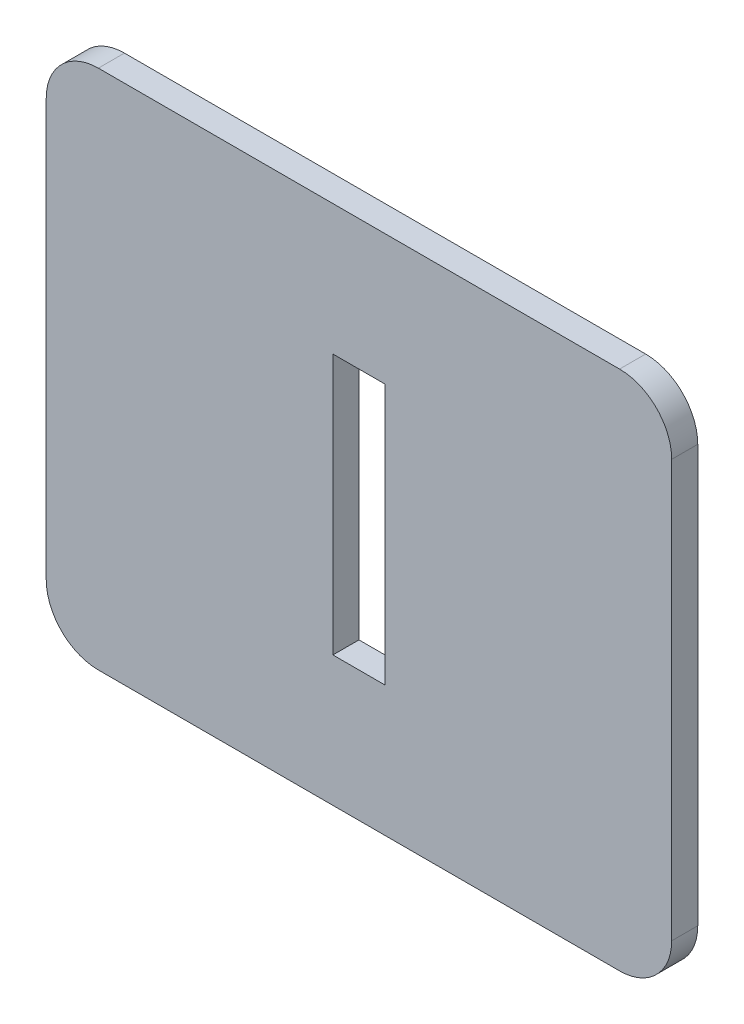
ISO-10303-21;
HEADER;
FILE_DESCRIPTION(('STEP AP214'),'2;1');
FILE_NAME('part.step','',(''),(''),'','','');
FILE_SCHEMA(('AUTOMOTIVE_DESIGN { 1 0 10303 214 1 1 1 1 }'));
ENDSEC;
DATA;
#1=APPLICATION_CONTEXT('core data for automotive mechanical design processes');
#2=APPLICATION_PROTOCOL_DEFINITION('international standard','automotive_design',2000,#1);
#3=PRODUCT_CONTEXT('',#1,'mechanical');
#4=PRODUCT('Part','Part','',(#3));
#5=PRODUCT_RELATED_PRODUCT_CATEGORY('part','',(#4));
#6=PRODUCT_DEFINITION_FORMATION('','',#4);
#7=PRODUCT_DEFINITION_CONTEXT('part definition',#1,'design');
#8=PRODUCT_DEFINITION('design','',#6,#7);
#9=PRODUCT_DEFINITION_SHAPE('','',#8);
#10=(LENGTH_UNIT() NAMED_UNIT(*) SI_UNIT(.MILLI.,.METRE.));
#11=(NAMED_UNIT(*) PLANE_ANGLE_UNIT() SI_UNIT($,.RADIAN.));
#12=(NAMED_UNIT(*) SI_UNIT($,.STERADIAN.) SOLID_ANGLE_UNIT());
#13=UNCERTAINTY_MEASURE_WITH_UNIT(LENGTH_MEASURE(1.E-05),#10,'distance_accuracy_value','');
#14=(GEOMETRIC_REPRESENTATION_CONTEXT(3) GLOBAL_UNCERTAINTY_ASSIGNED_CONTEXT((#13)) GLOBAL_UNIT_ASSIGNED_CONTEXT((#10,
#11,#12)) REPRESENTATION_CONTEXT('',''));
#15=CARTESIAN_POINT('',(0.,0.,0.));
#16=DIRECTION('',(0.,0.,1.));
#17=DIRECTION('',(1.,0.,0.));
#18=AXIS2_PLACEMENT_3D('',#15,#16,#17);
#19=CARTESIAN_POINT('',(110.,10.,5.));
#20=DIRECTION('',(0.,0.,1.));
#21=DIRECTION('',(1.,0.,0.));
#22=AXIS2_PLACEMENT_3D('',#19,#20,#21);
#23=PLANE('',#22);
#24=CARTESIAN_POINT('',(110.,10.,5.));
#25=DIRECTION('',(0.,0.,1.));
#26=DIRECTION('',(1.,0.,0.));
#27=AXIS2_PLACEMENT_3D('',#24,#25,#26);
#28=CIRCLE('',#27,10.);
#29=CARTESIAN_POINT('',(110.,0.,5.));
#30=VERTEX_POINT('',#29);
#31=CARTESIAN_POINT('',(120.,10.0000000000001,5.));
#32=VERTEX_POINT('',#31);
#33=EDGE_CURVE('E156',#30,#32,#28,.T.);
#34=ORIENTED_EDGE('',*,*,#33,.T.);
#35=DIRECTION('',(0.,1.,0.));
#36=VECTOR('',#35,1.);
#37=CARTESIAN_POINT('',(120.,10.0000000000001,5.));
#38=LINE('',#37,#36);
#39=CARTESIAN_POINT('',(120.,89.9999999999999,5.));
#40=VERTEX_POINT('',#39);
#41=EDGE_CURVE('E159',#32,#40,#38,.T.);
#42=ORIENTED_EDGE('',*,*,#41,.T.);
#43=CARTESIAN_POINT('',(110.,90.,5.));
#44=DIRECTION('',(0.,0.,1.));
#45=DIRECTION('',(-1.,0.,0.));
#46=AXIS2_PLACEMENT_3D('',#43,#44,#45);
#47=CIRCLE('',#46,9.99999999999999);
#48=CARTESIAN_POINT('',(110.,100.,5.));
#49=VERTEX_POINT('',#48);
#50=EDGE_CURVE('E162',#40,#49,#47,.T.);
#51=ORIENTED_EDGE('',*,*,#50,.T.);
#52=DIRECTION('',(-1.,0.,0.));
#53=VECTOR('',#52,1.);
#54=CARTESIAN_POINT('',(10.0000000000001,100.,5.));
#55=LINE('',#54,#53);
#56=CARTESIAN_POINT('',(10.0000000000001,100.,5.));
#57=VERTEX_POINT('',#56);
#58=EDGE_CURVE('E164',#49,#57,#55,.T.);
#59=ORIENTED_EDGE('',*,*,#58,.T.);
#60=CARTESIAN_POINT('',(10.,90.,5.));
#61=DIRECTION('',(0.,0.,1.));
#62=DIRECTION('',(-1.,0.,0.));
#63=AXIS2_PLACEMENT_3D('',#60,#61,#62);
#64=CIRCLE('',#63,10.);
#65=CARTESIAN_POINT('',(0.,89.9999999999999,5.));
#66=VERTEX_POINT('',#65);
#67=EDGE_CURVE('E166',#57,#66,#64,.T.);
#68=ORIENTED_EDGE('',*,*,#67,.T.);
#69=DIRECTION('',(0.,-1.,0.));
#70=VECTOR('',#69,1.);
#71=CARTESIAN_POINT('',(0.,10.0000000000001,5.));
#72=LINE('',#71,#70);
#73=CARTESIAN_POINT('',(0.,10.0000000000001,5.));
#74=VERTEX_POINT('',#73);
#75=EDGE_CURVE('E168',#66,#74,#72,.T.);
#76=ORIENTED_EDGE('',*,*,#75,.T.);
#77=CARTESIAN_POINT('',(10.,10.,5.));
#78=DIRECTION('',(0.,0.,1.));
#79=DIRECTION('',(-1.,0.,0.));
#80=AXIS2_PLACEMENT_3D('',#77,#78,#79);
#81=CIRCLE('',#80,10.);
#82=CARTESIAN_POINT('',(10.0000000000001,0.,5.));
#83=VERTEX_POINT('',#82);
#84=EDGE_CURVE('E170',#74,#83,#81,.T.);
#85=ORIENTED_EDGE('',*,*,#84,.T.);
#86=DIRECTION('',(1.,0.,0.));
#87=VECTOR('',#86,1.);
#88=CARTESIAN_POINT('',(10.0000000000001,0.,5.));
#89=LINE('',#88,#87);
#90=EDGE_CURVE('E172',#83,#30,#89,.T.);
#91=ORIENTED_EDGE('',*,*,#90,.T.);
#92=EDGE_LOOP('',(#34,#42,#51,#59,#68,#76,#85,#91));
#93=FACE_BOUND('',#92,.T.);
#94=DIRECTION('',(-1.,0.,0.));
#95=VECTOR('',#94,1.);
#96=CARTESIAN_POINT('',(55.,75.,5.));
#97=LINE('',#96,#95);
#98=CARTESIAN_POINT('',(65.,75.,5.));
#99=VERTEX_POINT('',#98);
#100=CARTESIAN_POINT('',(55.,75.,5.));
#101=VERTEX_POINT('',#100);
#102=EDGE_CURVE('E128',#99,#101,#97,.T.);
#103=ORIENTED_EDGE('',*,*,#102,.F.);
#104=DIRECTION('',(0.,1.,0.));
#105=VECTOR('',#104,1.);
#106=CARTESIAN_POINT('',(65.,75.,5.));
#107=LINE('',#106,#105);
#108=CARTESIAN_POINT('',(65.,25.,5.));
#109=VERTEX_POINT('',#108);
#110=EDGE_CURVE('E120',#109,#99,#107,.T.);
#111=ORIENTED_EDGE('',*,*,#110,.F.);
#112=DIRECTION('',(1.,0.,0.));
#113=VECTOR('',#112,1.);
#114=CARTESIAN_POINT('',(55.,25.,5.));
#115=LINE('',#114,#113);
#116=CARTESIAN_POINT('',(55.,25.,5.));
#117=VERTEX_POINT('',#116);
#118=EDGE_CURVE('E142',#117,#109,#115,.T.);
#119=ORIENTED_EDGE('',*,*,#118,.F.);
#120=DIRECTION('',(0.,-1.,0.));
#121=VECTOR('',#120,1.);
#122=CARTESIAN_POINT('',(55.,75.,5.));
#123=LINE('',#122,#121);
#124=EDGE_CURVE('E140',#101,#117,#123,.T.);
#125=ORIENTED_EDGE('',*,*,#124,.F.);
#126=EDGE_LOOP('',(#103,#111,#119,#125));
#127=FACE_BOUND('',#126,.T.);
#128=ADVANCED_FACE('F31',(#93,#127),#23,.T.);
#129=CARTESIAN_POINT('',(110.,10.,0.));
#130=DIRECTION('',(0.,0.,1.));
#131=DIRECTION('',(1.,0.,0.));
#132=AXIS2_PLACEMENT_3D('',#129,#130,#131);
#133=PLANE('',#132);
#134=CARTESIAN_POINT('',(110.,10.,0.));
#135=DIRECTION('',(0.,0.,1.));
#136=DIRECTION('',(1.,0.,0.));
#137=AXIS2_PLACEMENT_3D('',#134,#135,#136);
#138=CIRCLE('',#137,10.);
#139=CARTESIAN_POINT('',(110.,0.,0.));
#140=VERTEX_POINT('',#139);
#141=CARTESIAN_POINT('',(120.,10.0000000000001,0.));
#142=VERTEX_POINT('',#141);
#143=EDGE_CURVE('E136',#140,#142,#138,.T.);
#144=ORIENTED_EDGE('',*,*,#143,.F.);
#145=DIRECTION('',(1.,0.,0.));
#146=VECTOR('',#145,1.);
#147=CARTESIAN_POINT('',(10.0000000000001,0.,0.));
#148=LINE('',#147,#146);
#149=CARTESIAN_POINT('',(10.0000000000001,0.,0.));
#150=VERTEX_POINT('',#149);
#151=EDGE_CURVE('E160',#150,#140,#148,.T.);
#152=ORIENTED_EDGE('',*,*,#151,.F.);
#153=CARTESIAN_POINT('',(10.,10.,0.));
#154=DIRECTION('',(0.,0.,1.));
#155=DIRECTION('',(-1.,0.,0.));
#156=AXIS2_PLACEMENT_3D('',#153,#154,#155);
#157=CIRCLE('',#156,10.);
#158=CARTESIAN_POINT('',(0.,10.0000000000001,0.));
#159=VERTEX_POINT('',#158);
#160=EDGE_CURVE('E187',#159,#150,#157,.T.);
#161=ORIENTED_EDGE('',*,*,#160,.F.);
#162=DIRECTION('',(0.,-1.,0.));
#163=VECTOR('',#162,1.);
#164=CARTESIAN_POINT('',(0.,10.0000000000001,0.));
#165=LINE('',#164,#163);
#166=CARTESIAN_POINT('',(0.,89.9999999999999,0.));
#167=VERTEX_POINT('',#166);
#168=EDGE_CURVE('E185',#167,#159,#165,.T.);
#169=ORIENTED_EDGE('',*,*,#168,.F.);
#170=CARTESIAN_POINT('',(10.,90.,0.));
#171=DIRECTION('',(0.,0.,1.));
#172=DIRECTION('',(-1.,0.,0.));
#173=AXIS2_PLACEMENT_3D('',#170,#171,#172);
#174=CIRCLE('',#173,10.);
#175=CARTESIAN_POINT('',(10.0000000000001,100.,0.));
#176=VERTEX_POINT('',#175);
#177=EDGE_CURVE('E183',#176,#167,#174,.T.);
#178=ORIENTED_EDGE('',*,*,#177,.F.);
#179=DIRECTION('',(-1.,0.,0.));
#180=VECTOR('',#179,1.);
#181=CARTESIAN_POINT('',(10.0000000000001,100.,0.));
#182=LINE('',#181,#180);
#183=CARTESIAN_POINT('',(110.,100.,0.));
#184=VERTEX_POINT('',#183);
#185=EDGE_CURVE('E181',#184,#176,#182,.T.);
#186=ORIENTED_EDGE('',*,*,#185,.F.);
#187=CARTESIAN_POINT('',(110.,90.,0.));
#188=DIRECTION('',(0.,0.,1.));
#189=DIRECTION('',(-1.,0.,0.));
#190=AXIS2_PLACEMENT_3D('',#187,#188,#189);
#191=CIRCLE('',#190,9.99999999999999);
#192=CARTESIAN_POINT('',(120.,89.9999999999999,0.));
#193=VERTEX_POINT('',#192);
#194=EDGE_CURVE('E179',#193,#184,#191,.T.);
#195=ORIENTED_EDGE('',*,*,#194,.F.);
#196=DIRECTION('',(0.,1.,0.));
#197=VECTOR('',#196,1.);
#198=CARTESIAN_POINT('',(120.,10.0000000000001,0.));
#199=LINE('',#198,#197);
#200=EDGE_CURVE('E177',#142,#193,#199,.T.);
#201=ORIENTED_EDGE('',*,*,#200,.F.);
#202=EDGE_LOOP('',(#144,#152,#161,#169,#178,#186,#195,#201));
#203=FACE_BOUND('',#202,.T.);
#204=DIRECTION('',(0.,1.,0.));
#205=VECTOR('',#204,1.);
#206=CARTESIAN_POINT('',(65.,75.,0.));
#207=LINE('',#206,#205);
#208=CARTESIAN_POINT('',(65.,25.,0.));
#209=VERTEX_POINT('',#208);
#210=CARTESIAN_POINT('',(65.,75.,0.));
#211=VERTEX_POINT('',#210);
#212=EDGE_CURVE('E54',#209,#211,#207,.T.);
#213=ORIENTED_EDGE('',*,*,#212,.T.);
#214=DIRECTION('',(-1.,0.,0.));
#215=VECTOR('',#214,1.);
#216=CARTESIAN_POINT('',(55.,75.,0.));
#217=LINE('',#216,#215);
#218=CARTESIAN_POINT('',(55.,75.,0.));
#219=VERTEX_POINT('',#218);
#220=EDGE_CURVE('E135',#211,#219,#217,.T.);
#221=ORIENTED_EDGE('',*,*,#220,.T.);
#222=DIRECTION('',(0.,-1.,0.));
#223=VECTOR('',#222,1.);
#224=CARTESIAN_POINT('',(55.,75.,0.));
#225=LINE('',#224,#223);
#226=CARTESIAN_POINT('',(55.,25.,0.));
#227=VERTEX_POINT('',#226);
#228=EDGE_CURVE('E148',#219,#227,#225,.T.);
#229=ORIENTED_EDGE('',*,*,#228,.T.);
#230=DIRECTION('',(1.,0.,0.));
#231=VECTOR('',#230,1.);
#232=CARTESIAN_POINT('',(55.,25.,0.));
#233=LINE('',#232,#231);
#234=EDGE_CURVE('E129',#227,#209,#233,.T.);
#235=ORIENTED_EDGE('',*,*,#234,.T.);
#236=EDGE_LOOP('',(#213,#221,#229,#235));
#237=FACE_BOUND('',#236,.T.);
#238=ADVANCED_FACE('F217',(#203,#237),#133,.F.);
#239=CARTESIAN_POINT('',(110.,10.,5.));
#240=DIRECTION('',(0.,0.,-1.));
#241=DIRECTION('',(-1.,0.,0.));
#242=AXIS2_PLACEMENT_3D('',#239,#240,#241);
#243=CYLINDRICAL_SURFACE('',#242,10.);
#244=ORIENTED_EDGE('',*,*,#143,.T.);
#245=DIRECTION('',(0.,0.,-1.));
#246=VECTOR('',#245,1.);
#247=CARTESIAN_POINT('',(120.,10.0000000000001,5.));
#248=LINE('',#247,#246);
#249=EDGE_CURVE('E11',#32,#142,#248,.T.);
#250=ORIENTED_EDGE('',*,*,#249,.F.);
#251=ORIENTED_EDGE('',*,*,#33,.F.);
#252=DIRECTION('',(0.,0.,-1.));
#253=VECTOR('',#252,1.);
#254=CARTESIAN_POINT('',(110.,0.,5.));
#255=LINE('',#254,#253);
#256=EDGE_CURVE('E174',#30,#140,#255,.T.);
#257=ORIENTED_EDGE('',*,*,#256,.T.);
#258=EDGE_LOOP('',(#244,#250,#251,#257));
#259=FACE_BOUND('',#258,.T.);
#260=ADVANCED_FACE('F33',(#259),#243,.T.);
#261=CARTESIAN_POINT('',(120.,10.0000000000001,5.));
#262=DIRECTION('',(-1.,0.,0.));
#263=DIRECTION('',(0.,0.,1.));
#264=AXIS2_PLACEMENT_3D('',#261,#262,#263);
#265=PLANE('',#264);
#266=ORIENTED_EDGE('',*,*,#200,.T.);
#267=DIRECTION('',(0.,0.,-1.));
#268=VECTOR('',#267,1.);
#269=CARTESIAN_POINT('',(120.,89.9999999999999,5.));
#270=LINE('',#269,#268);
#271=EDGE_CURVE('E39',#40,#193,#270,.T.);
#272=ORIENTED_EDGE('',*,*,#271,.F.);
#273=ORIENTED_EDGE('',*,*,#41,.F.);
#274=ORIENTED_EDGE('',*,*,#249,.T.);
#275=EDGE_LOOP('',(#266,#272,#273,#274));
#276=FACE_BOUND('',#275,.T.);
#277=ADVANCED_FACE('F234',(#276),#265,.F.);
#278=CARTESIAN_POINT('',(110.,90.,5.));
#279=DIRECTION('',(0.,0.,-1.));
#280=DIRECTION('',(-1.,0.,0.));
#281=AXIS2_PLACEMENT_3D('',#278,#279,#280);
#282=CYLINDRICAL_SURFACE('',#281,9.99999999999999);
#283=ORIENTED_EDGE('',*,*,#194,.T.);
#284=DIRECTION('',(0.,0.,-1.));
#285=VECTOR('',#284,1.);
#286=CARTESIAN_POINT('',(110.,100.,5.));
#287=LINE('',#286,#285);
#288=EDGE_CURVE('E204',#49,#184,#287,.T.);
#289=ORIENTED_EDGE('',*,*,#288,.F.);
#290=ORIENTED_EDGE('',*,*,#50,.F.);
#291=ORIENTED_EDGE('',*,*,#271,.T.);
#292=EDGE_LOOP('',(#283,#289,#290,#291));
#293=FACE_BOUND('',#292,.T.);
#294=ADVANCED_FACE('F211',(#293),#282,.T.);
#295=CARTESIAN_POINT('',(10.0000000000001,100.,5.));
#296=DIRECTION('',(0.,-1.,0.));
#297=DIRECTION('',(0.,0.,-1.));
#298=AXIS2_PLACEMENT_3D('',#295,#296,#297);
#299=PLANE('',#298);
#300=ORIENTED_EDGE('',*,*,#185,.T.);
#301=DIRECTION('',(0.,0.,-1.));
#302=VECTOR('',#301,1.);
#303=CARTESIAN_POINT('',(10.0000000000001,100.,5.));
#304=LINE('',#303,#302);
#305=EDGE_CURVE('E201',#57,#176,#304,.T.);
#306=ORIENTED_EDGE('',*,*,#305,.F.);
#307=ORIENTED_EDGE('',*,*,#58,.F.);
#308=ORIENTED_EDGE('',*,*,#288,.T.);
#309=EDGE_LOOP('',(#300,#306,#307,#308));
#310=FACE_BOUND('',#309,.T.);
#311=ADVANCED_FACE('F223',(#310),#299,.F.);
#312=CARTESIAN_POINT('',(10.,90.,5.));
#313=DIRECTION('',(0.,0.,-1.));
#314=DIRECTION('',(-1.,0.,0.));
#315=AXIS2_PLACEMENT_3D('',#312,#313,#314);
#316=CYLINDRICAL_SURFACE('',#315,10.);
#317=ORIENTED_EDGE('',*,*,#177,.T.);
#318=DIRECTION('',(0.,0.,-1.));
#319=VECTOR('',#318,1.);
#320=CARTESIAN_POINT('',(0.,89.9999999999999,5.));
#321=LINE('',#320,#319);
#322=EDGE_CURVE('E198',#66,#167,#321,.T.);
#323=ORIENTED_EDGE('',*,*,#322,.F.);
#324=ORIENTED_EDGE('',*,*,#67,.F.);
#325=ORIENTED_EDGE('',*,*,#305,.T.);
#326=EDGE_LOOP('',(#317,#323,#324,#325));
#327=FACE_BOUND('',#326,.T.);
#328=ADVANCED_FACE('F227',(#327),#316,.T.);
#329=CARTESIAN_POINT('',(0.,10.0000000000001,5.));
#330=DIRECTION('',(1.,0.,0.));
#331=DIRECTION('',(0.,0.,-1.));
#332=AXIS2_PLACEMENT_3D('',#329,#330,#331);
#333=PLANE('',#332);
#334=ORIENTED_EDGE('',*,*,#168,.T.);
#335=DIRECTION('',(0.,0.,-1.));
#336=VECTOR('',#335,1.);
#337=CARTESIAN_POINT('',(0.,10.0000000000001,5.));
#338=LINE('',#337,#336);
#339=EDGE_CURVE('E195',#74,#159,#338,.T.);
#340=ORIENTED_EDGE('',*,*,#339,.F.);
#341=ORIENTED_EDGE('',*,*,#75,.F.);
#342=ORIENTED_EDGE('',*,*,#322,.T.);
#343=EDGE_LOOP('',(#334,#340,#341,#342));
#344=FACE_BOUND('',#343,.T.);
#345=ADVANCED_FACE('F247',(#344),#333,.F.);
#346=CARTESIAN_POINT('',(10.,10.,5.));
#347=DIRECTION('',(0.,0.,-1.));
#348=DIRECTION('',(-1.,0.,0.));
#349=AXIS2_PLACEMENT_3D('',#346,#347,#348);
#350=CYLINDRICAL_SURFACE('',#349,10.);
#351=ORIENTED_EDGE('',*,*,#160,.T.);
#352=DIRECTION('',(0.,0.,-1.));
#353=VECTOR('',#352,1.);
#354=CARTESIAN_POINT('',(10.0000000000001,0.,5.));
#355=LINE('',#354,#353);
#356=EDGE_CURVE('E192',#83,#150,#355,.T.);
#357=ORIENTED_EDGE('',*,*,#356,.F.);
#358=ORIENTED_EDGE('',*,*,#84,.F.);
#359=ORIENTED_EDGE('',*,*,#339,.T.);
#360=EDGE_LOOP('',(#351,#357,#358,#359));
#361=FACE_BOUND('',#360,.T.);
#362=ADVANCED_FACE('F245',(#361),#350,.T.);
#363=CARTESIAN_POINT('',(10.0000000000001,0.,5.));
#364=DIRECTION('',(0.,1.,0.));
#365=DIRECTION('',(0.,0.,1.));
#366=AXIS2_PLACEMENT_3D('',#363,#364,#365);
#367=PLANE('',#366);
#368=ORIENTED_EDGE('',*,*,#151,.T.);
#369=ORIENTED_EDGE('',*,*,#256,.F.);
#370=ORIENTED_EDGE('',*,*,#90,.F.);
#371=ORIENTED_EDGE('',*,*,#356,.T.);
#372=EDGE_LOOP('',(#368,#369,#370,#371));
#373=FACE_BOUND('',#372,.T.);
#374=ADVANCED_FACE('F240',(#373),#367,.F.);
#375=CARTESIAN_POINT('',(65.,75.,5.));
#376=DIRECTION('',(-1.,0.,0.));
#377=DIRECTION('',(0.,0.,1.));
#378=AXIS2_PLACEMENT_3D('',#375,#376,#377);
#379=PLANE('',#378);
#380=ORIENTED_EDGE('',*,*,#212,.F.);
#381=DIRECTION('',(0.,0.,-1.));
#382=VECTOR('',#381,1.);
#383=CARTESIAN_POINT('',(65.,25.,5.));
#384=LINE('',#383,#382);
#385=EDGE_CURVE('E124',#109,#209,#384,.T.);
#386=ORIENTED_EDGE('',*,*,#385,.F.);
#387=ORIENTED_EDGE('',*,*,#110,.T.);
#388=DIRECTION('',(0.,0.,-1.));
#389=VECTOR('',#388,1.);
#390=CARTESIAN_POINT('',(65.,75.,5.));
#391=LINE('',#390,#389);
#392=EDGE_CURVE('E123',#99,#211,#391,.T.);
#393=ORIENTED_EDGE('',*,*,#392,.T.);
#394=EDGE_LOOP('',(#380,#386,#387,#393));
#395=FACE_BOUND('',#394,.T.);
#396=ADVANCED_FACE('F122',(#395),#379,.T.);
#397=CARTESIAN_POINT('',(55.,75.,5.));
#398=DIRECTION('',(0.,-1.,0.));
#399=DIRECTION('',(0.,0.,-1.));
#400=AXIS2_PLACEMENT_3D('',#397,#398,#399);
#401=PLANE('',#400);
#402=ORIENTED_EDGE('',*,*,#220,.F.);
#403=ORIENTED_EDGE('',*,*,#392,.F.);
#404=ORIENTED_EDGE('',*,*,#102,.T.);
#405=DIRECTION('',(0.,0.,-1.));
#406=VECTOR('',#405,1.);
#407=CARTESIAN_POINT('',(55.,75.,5.));
#408=LINE('',#407,#406);
#409=EDGE_CURVE('E137',#101,#219,#408,.T.);
#410=ORIENTED_EDGE('',*,*,#409,.T.);
#411=EDGE_LOOP('',(#402,#403,#404,#410));
#412=FACE_BOUND('',#411,.T.);
#413=ADVANCED_FACE('F132',(#412),#401,.T.);
#414=CARTESIAN_POINT('',(55.,75.,5.));
#415=DIRECTION('',(1.,0.,0.));
#416=DIRECTION('',(0.,1.,0.));
#417=AXIS2_PLACEMENT_3D('',#414,#415,#416);
#418=PLANE('',#417);
#419=ORIENTED_EDGE('',*,*,#228,.F.);
#420=ORIENTED_EDGE('',*,*,#409,.F.);
#421=ORIENTED_EDGE('',*,*,#124,.T.);
#422=DIRECTION('',(0.,0.,-1.));
#423=VECTOR('',#422,1.);
#424=CARTESIAN_POINT('',(55.,25.,5.));
#425=LINE('',#424,#423);
#426=EDGE_CURVE('E46',#117,#227,#425,.T.);
#427=ORIENTED_EDGE('',*,*,#426,.T.);
#428=EDGE_LOOP('',(#419,#420,#421,#427));
#429=FACE_BOUND('',#428,.T.);
#430=ADVANCED_FACE('F272',(#429),#418,.T.);
#431=CARTESIAN_POINT('',(55.,25.,5.));
#432=DIRECTION('',(0.,1.,0.));
#433=DIRECTION('',(0.,0.,1.));
#434=AXIS2_PLACEMENT_3D('',#431,#432,#433);
#435=PLANE('',#434);
#436=ORIENTED_EDGE('',*,*,#234,.F.);
#437=ORIENTED_EDGE('',*,*,#426,.F.);
#438=ORIENTED_EDGE('',*,*,#118,.T.);
#439=ORIENTED_EDGE('',*,*,#385,.T.);
#440=EDGE_LOOP('',(#436,#437,#438,#439));
#441=FACE_BOUND('',#440,.T.);
#442=ADVANCED_FACE('F276',(#441),#435,.T.);
#443=CLOSED_SHELL('',(#128,#238,#260,#277,#294,#311,#328,#345,#362,#374,#396,#413,#430,#442));
#444=MANIFOLD_SOLID_BREP('B2',#443);
#445=ADVANCED_BREP_SHAPE_REPRESENTATION('',(#18,#444),#14);
#446=SHAPE_DEFINITION_REPRESENTATION(#9,#445);
ENDSEC;
END-ISO-10303-21;
